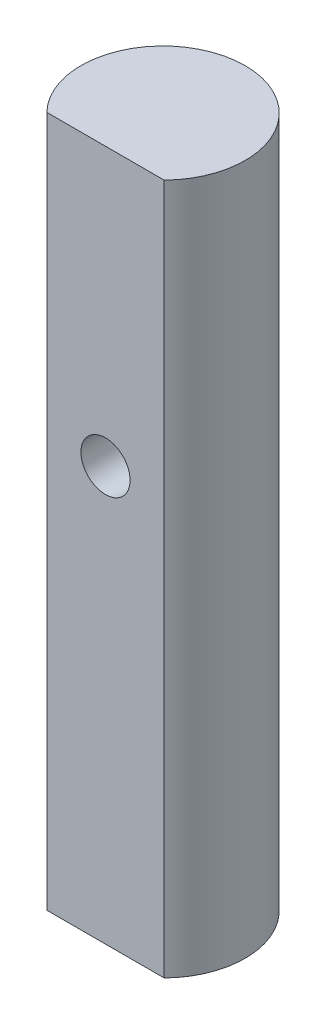
ISO-10303-21;
HEADER;
FILE_DESCRIPTION(('STEP AP214'),'2;1');
FILE_NAME('part.step','',(''),(''),'','','');
FILE_SCHEMA(('AUTOMOTIVE_DESIGN { 1 0 10303 214 1 1 1 1 }'));
ENDSEC;
DATA;
#1=APPLICATION_CONTEXT('core data for automotive mechanical design processes');
#2=APPLICATION_PROTOCOL_DEFINITION('international standard','automotive_design',2000,#1);
#3=PRODUCT_CONTEXT('',#1,'mechanical');
#4=PRODUCT('Part','Part','',(#3));
#5=PRODUCT_RELATED_PRODUCT_CATEGORY('part','',(#4));
#6=PRODUCT_DEFINITION_FORMATION('','',#4);
#7=PRODUCT_DEFINITION_CONTEXT('part definition',#1,'design');
#8=PRODUCT_DEFINITION('design','',#6,#7);
#9=PRODUCT_DEFINITION_SHAPE('','',#8);
#10=(LENGTH_UNIT() NAMED_UNIT(*) SI_UNIT(.MILLI.,.METRE.));
#11=(NAMED_UNIT(*) PLANE_ANGLE_UNIT() SI_UNIT($,.RADIAN.));
#12=(NAMED_UNIT(*) SI_UNIT($,.STERADIAN.) SOLID_ANGLE_UNIT());
#13=UNCERTAINTY_MEASURE_WITH_UNIT(LENGTH_MEASURE(1.E-05),#10,'distance_accuracy_value','');
#14=(GEOMETRIC_REPRESENTATION_CONTEXT(3) GLOBAL_UNCERTAINTY_ASSIGNED_CONTEXT((#13)) GLOBAL_UNIT_ASSIGNED_CONTEXT((#10,
#11,#12)) REPRESENTATION_CONTEXT('',''));
#15=CARTESIAN_POINT('',(0.,0.,0.));
#16=DIRECTION('',(0.,0.,1.));
#17=DIRECTION('',(1.,0.,0.));
#18=AXIS2_PLACEMENT_3D('',#15,#16,#17);
#19=CARTESIAN_POINT('',(0.,53.4019024719999,0.));
#20=DIRECTION('',(0.,-1.,0.));
#21=DIRECTION('',(0.,0.,-1.));
#22=AXIS2_PLACEMENT_3D('',#19,#20,#21);
#23=CYLINDRICAL_SURFACE('',#22,6.35);
#24=CARTESIAN_POINT('',(0.,30.089475,-6.3500000000003));
#25=CARTESIAN_POINT('',(0.104174230071378,30.0894763060569,-6.34999907745002));
#26=CARTESIAN_POINT('',(0.208361677234885,30.0980771084391,-6.34741194322595));
#27=CARTESIAN_POINT('',(0.413703564897657,30.1321720735472,-6.33734405929361));
#28=CARTESIAN_POINT('',(0.514857073747801,30.1576713709863,-6.32986182218663));
#29=CARTESIAN_POINT('',(0.711139592873193,30.2246365760004,-6.31082376723533));
#30=CARTESIAN_POINT('',(0.806277218635521,30.2660790190154,-6.29927393803215));
#31=CARTESIAN_POINT('',(0.988253187796923,30.3636581822995,-6.27330179744045));
#32=CARTESIAN_POINT('',(1.07509044153308,30.4197968282617,-6.25887910967084));
#33=CARTESIAN_POINT('',(1.24047891030717,30.5468630245919,-6.22823999433316));
#34=CARTESIAN_POINT('',(1.31875979836932,30.618133590062,-6.21198699198934));
#35=CARTESIAN_POINT('',(1.46245535318967,30.7727093681745,-6.17973775823127));
#36=CARTESIAN_POINT('',(1.52786787234964,30.8560165855932,-6.16374157008506));
#37=CARTESIAN_POINT('',(1.64538908787593,31.0345841316211,-6.13343056671382));
#38=CARTESIAN_POINT('',(1.69716842823095,31.1300696638274,-6.11916122325647));
#39=CARTESIAN_POINT('',(1.78382461525216,31.3288884312869,-6.09446589742613));
#40=CARTESIAN_POINT('',(1.81870549028692,31.4322197893992,-6.08403899920748));
#41=CARTESIAN_POINT('',(1.86960095013749,31.6407627435154,-6.06859017174986));
#42=CARTESIAN_POINT('',(1.88611365020934,31.7458419444882,-6.06342587458966));
#43=CARTESIAN_POINT('',(1.90135937321492,31.9573963532608,-6.05866338815991));
#44=CARTESIAN_POINT('',(1.90009667171744,32.0638712192016,-6.05906386037997));
#45=CARTESIAN_POINT('',(1.88021881579598,32.2711490599442,-6.06525944714982));
#46=CARTESIAN_POINT('',(1.86222702847388,32.3720185664934,-6.07086075515797));
#47=CARTESIAN_POINT('',(1.81040860261061,32.5692365173697,-6.08651344917327));
#48=CARTESIAN_POINT('',(1.77658041070945,32.6655845171715,-6.09656527171689));
#49=CARTESIAN_POINT('',(1.69358876358904,32.852552371175,-6.12014156612633));
#50=CARTESIAN_POINT('',(1.64422262512324,32.9430762815995,-6.13371149128894));
#51=CARTESIAN_POINT('',(1.53169729719298,33.1147644417618,-6.16277307320922));
#52=CARTESIAN_POINT('',(1.46853478416468,33.195926428989,-6.17826519263676));
#53=CARTESIAN_POINT('',(1.3271108490196,33.3501232962879,-6.210212245628));
#54=CARTESIAN_POINT('',(1.24833191932304,33.4226815957898,-6.22668046499809));
#55=CARTESIAN_POINT('',(1.07951936513868,33.5536676838104,-6.25815467195813));
#56=CARTESIAN_POINT('',(0.989485042148462,33.6120945946833,-6.27316056869434));
#57=CARTESIAN_POINT('',(0.799855333702407,33.7134461892695,-6.30015487523226));
#58=CARTESIAN_POINT('',(0.700200638080903,33.7562657623259,-6.31212266638949));
#59=CARTESIAN_POINT('',(0.494663437454944,33.8243964137821,-6.33154372644205));
#60=CARTESIAN_POINT('',(0.388782666341643,33.849712341926,-6.33899824576079));
#61=CARTESIAN_POINT('',(0.177850894597573,33.8813250751772,-6.34835533637998));
#62=CARTESIAN_POINT('',(0.0729049226430506,33.8882678494776,-6.35044639318698));
#63=CARTESIAN_POINT('',(-0.136659129006901,33.8847469170019,-6.34939358227364));
#64=CARTESIAN_POINT('',(-0.241277250313167,33.8742855169016,-6.34625040827613));
#65=CARTESIAN_POINT('',(-0.444781942193917,33.8367757706514,-6.33520564342841));
#66=CARTESIAN_POINT('',(-0.543744413662501,33.8101043412288,-6.32741225271153));
#67=CARTESIAN_POINT('',(-0.735768622856862,33.7413846270467,-6.30796848523179));
#68=CARTESIAN_POINT('',(-0.828829651453886,33.6993344984459,-6.29631764599294));
#69=CARTESIAN_POINT('',(-1.00879032004296,33.5999631485079,-6.27003255890797));
#70=CARTESIAN_POINT('',(-1.09549867740114,33.5423125006762,-6.25533577597258));
#71=CARTESIAN_POINT('',(-1.25823067273906,33.4137773337544,-6.22464652181085));
#72=CARTESIAN_POINT('',(-1.3342516416571,33.3428895190775,-6.20865372848617));
#73=CARTESIAN_POINT('',(-1.47629145056279,33.1868578015954,-6.17645243900759));
#74=CARTESIAN_POINT('',(-1.54185080419523,33.101292026314,-6.16025695785639));
#75=CARTESIAN_POINT('',(-1.65771183079171,32.9200218443067,-6.13009694049584));
#76=CARTESIAN_POINT('',(-1.70801391463706,32.8243177107024,-6.11613234421311));
#77=CARTESIAN_POINT('',(-1.79158652861863,32.6257994239489,-6.09217616531615));
#78=CARTESIAN_POINT('',(-1.82493730082878,32.5230214339582,-6.0821659152729));
#79=CARTESIAN_POINT('',(-1.87375981206238,32.3129535004674,-6.06730484103354));
#80=CARTESIAN_POINT('',(-1.88923762630833,32.2056651029657,-6.06245226373024));
#81=CARTESIAN_POINT('',(-1.90146374813229,31.9943929826514,-6.05862786351808));
#82=CARTESIAN_POINT('',(-1.89896073312194,31.8904562717344,-6.05942095598844));
#83=CARTESIAN_POINT('',(-1.87708175514671,31.6845576171648,-6.06623379445782));
#84=CARTESIAN_POINT('',(-1.85770645947701,31.5825955955768,-6.07225333375194));
#85=CARTESIAN_POINT('',(-1.80311475679839,31.3847556021407,-6.08868365405113));
#86=CARTESIAN_POINT('',(-1.76809533443216,31.2888183961893,-6.09903973249438));
#87=CARTESIAN_POINT('',(-1.68336272312535,31.1041045470197,-6.12296653822529));
#88=CARTESIAN_POINT('',(-1.6336467363105,31.0153292713618,-6.13653787752392));
#89=CARTESIAN_POINT('',(-1.51882382377394,30.843981878476,-6.16597947053965));
#90=CARTESIAN_POINT('',(-1.45322474564031,30.7617508112098,-6.18191517730378));
#91=CARTESIAN_POINT('',(-1.30938518586601,30.6092211502521,-6.21397068703907));
#92=CARTESIAN_POINT('',(-1.23114143189494,30.538925655064,-6.23009053665855));
#93=CARTESIAN_POINT('',(-1.06150299275839,30.4102336768806,-6.26125794809995));
#94=CARTESIAN_POINT('',(-0.969792965367136,30.3522409539669,-6.27626091077484));
#95=CARTESIAN_POINT('',(-0.777475778034629,30.2525791952375,-6.30297006599699));
#96=CARTESIAN_POINT('',(-0.676872858099818,30.2109024311114,-6.3146778186319));
#97=CARTESIAN_POINT('',(-0.480946828717836,30.1488465361612,-6.3324396356006));
#98=CARTESIAN_POINT('',(-0.386241934326995,30.1266422618804,-6.33897056340221));
#99=CARTESIAN_POINT('',(-0.194361588258421,30.0969570961475,-6.34775082360895));
#100=CARTESIAN_POINT('',(-0.0971865458476309,30.0894737815494,-6.35000086066877));
#101=CARTESIAN_POINT('',(0.,30.089475,-6.3500000000003));
#102=B_SPLINE_CURVE_WITH_KNOTS('',3,(#24,#25,#26,#27,#28,#29,#30,#31,#32,#33,#34,#35,#36,#37,
#38,#39,#40,#41,#42,#43,#44,#45,#46,#47,#48,#49,#50,#51,#52,#53,#54,#55,#56,#57,#58,#59,#60,#61,
#62,#63,#64,#65,#66,#67,#68,#69,#70,#71,#72,#73,#74,#75,#76,#77,#78,#79,#80,#81,#82,#83,#84,#85,
#86,#87,#88,#89,#90,#91,#92,#93,#94,#95,#96,#97,#98,#99,#100,#101),.UNSPECIFIED.,.T.,.F.,(4,2,2,
2,2,2,2,2,2,2,2,2,2,2,2,2,2,2,2,2,2,2,2,2,2,2,2,2,2,2,2,2,2,2,2,2,2,2,4),(0.,0.312165720584867,
0.624426338188593,0.936229129018975,1.24807279689,1.5679313519463,1.88784324289994,
2.21489216211495,2.54186307882265,2.8597328117592,3.17752608787557,3.48393269114425,
3.79036935549848,4.10098164824076,4.41166885056053,4.73523962855106,5.05883049711221,
5.38456205379573,5.7102033236566,6.02423336275797,6.33822178495754,6.64517465691197,
6.95216434329717,7.26622482669834,7.58036360456408,7.90582936913734,8.23128636807428,
8.55518806464503,8.87897963089216,9.18936986001776,9.49974781383187,9.80632319022193,
10.1129569688578,10.4306947974601,10.7485149858714,11.0755434088709,11.4024167417515,
11.6936913033873,11.9849179157164),.UNSPECIFIED.);
#103=CARTESIAN_POINT('',(0.,30.089475,-6.3500000000003));
#104=VERTEX_POINT('',#103);
#105=EDGE_CURVE('E13',#104,#104,#102,.T.);
#106=ORIENTED_EDGE('',*,*,#105,.T.);
#107=EDGE_LOOP('',(#106));
#108=FACE_BOUND('',#107,.T.);
#109=CARTESIAN_POINT('',(0.,53.4019024719999,0.));
#110=DIRECTION('',(0.,1.,0.));
#111=DIRECTION('',(0.,0.,1.));
#112=AXIS2_PLACEMENT_3D('',#109,#110,#111);
#113=CIRCLE('',#112,6.35);
#114=CARTESIAN_POINT('',(4.53480705212471,53.4019024719998,4.44499999999959));
#115=VERTEX_POINT('',#114);
#116=CARTESIAN_POINT('',(-4.53480705212471,53.4019024719998,4.44499999999959));
#117=VERTEX_POINT('',#116);
#118=EDGE_CURVE('E86',#115,#117,#113,.T.);
#119=ORIENTED_EDGE('',*,*,#118,.F.);
#120=DIRECTION('',(0.,-1.,0.));
#121=VECTOR('',#120,1.);
#122=CARTESIAN_POINT('',(4.53480705212471,53.4019024719998,4.44499999999959));
#123=LINE('',#122,#121);
#124=CARTESIAN_POINT('',(4.53480705212471,-1.11022302462516E-13,4.44499999999959));
#125=VERTEX_POINT('',#124);
#126=EDGE_CURVE('E73',#115,#125,#123,.T.);
#127=ORIENTED_EDGE('',*,*,#126,.T.);
#128=CARTESIAN_POINT('',(0.,0.,0.));
#129=DIRECTION('',(0.,1.,0.));
#130=DIRECTION('',(0.,0.,1.));
#131=AXIS2_PLACEMENT_3D('',#128,#129,#130);
#132=CIRCLE('',#131,6.35);
#133=CARTESIAN_POINT('',(-4.53480705212471,-1.11022302462516E-13,4.44499999999959));
#134=VERTEX_POINT('',#133);
#135=EDGE_CURVE('E81',#125,#134,#132,.T.);
#136=ORIENTED_EDGE('',*,*,#135,.T.);
#137=DIRECTION('',(0.,-1.,0.));
#138=VECTOR('',#137,1.);
#139=CARTESIAN_POINT('',(-4.53480705212471,53.4019024719998,4.44499999999959));
#140=LINE('',#139,#138);
#141=EDGE_CURVE('E65',#134,#117,#140,.F.);
#142=ORIENTED_EDGE('',*,*,#141,.T.);
#143=EDGE_LOOP('',(#119,#127,#136,#142));
#144=FACE_BOUND('',#143,.T.);
#145=ADVANCED_FACE('F47',(#108,#144),#23,.T.);
#146=CARTESIAN_POINT('',(0.,53.4019024719999,0.));
#147=DIRECTION('',(0.,1.,0.));
#148=DIRECTION('',(0.,0.,1.));
#149=AXIS2_PLACEMENT_3D('',#146,#147,#148);
#150=PLANE('',#149);
#151=DIRECTION('',(-1.,0.,0.));
#152=VECTOR('',#151,1.);
#153=CARTESIAN_POINT('',(0.,53.4019024719998,4.44499999999959));
#154=LINE('',#153,#152);
#155=EDGE_CURVE('E76',#115,#117,#154,.T.);
#156=ORIENTED_EDGE('',*,*,#155,.F.);
#157=ORIENTED_EDGE('',*,*,#118,.T.);
#158=EDGE_LOOP('',(#156,#157));
#159=FACE_BOUND('',#158,.T.);
#160=ADVANCED_FACE('F85',(#159),#150,.T.);
#161=CARTESIAN_POINT('',(0.,0.,0.));
#162=DIRECTION('',(0.,1.,0.));
#163=DIRECTION('',(0.,0.,1.));
#164=AXIS2_PLACEMENT_3D('',#161,#162,#163);
#165=PLANE('',#164);
#166=ORIENTED_EDGE('',*,*,#135,.F.);
#167=DIRECTION('',(-1.,0.,0.));
#168=VECTOR('',#167,1.);
#169=CARTESIAN_POINT('',(0.,-1.11022302462516E-13,4.44499999999959));
#170=LINE('',#169,#168);
#171=EDGE_CURVE('E58',#125,#134,#170,.T.);
#172=ORIENTED_EDGE('',*,*,#171,.T.);
#173=EDGE_LOOP('',(#166,#172));
#174=FACE_BOUND('',#173,.T.);
#175=ADVANCED_FACE('F100',(#174),#165,.F.);
#176=CARTESIAN_POINT('',(0.,-1.11022302462516E-13,4.44499999999959));
#177=DIRECTION('',(0.,0.,-1.));
#178=DIRECTION('',(-1.,0.,0.));
#179=AXIS2_PLACEMENT_3D('',#176,#177,#178);
#180=PLANE('',#179);
#181=CARTESIAN_POINT('',(0.,31.9881249999999,4.44499999999959));
#182=DIRECTION('',(0.,0.,1.));
#183=DIRECTION('',(1.,0.,0.));
#184=AXIS2_PLACEMENT_3D('',#181,#182,#183);
#185=CIRCLE('',#184,1.89865);
#186=CARTESIAN_POINT('',(1.89865,31.9881249999999,4.44499999999959));
#187=VERTEX_POINT('',#186);
#188=EDGE_CURVE('E87',#187,#187,#185,.T.);
#189=ORIENTED_EDGE('',*,*,#188,.F.);
#190=EDGE_LOOP('',(#189));
#191=FACE_BOUND('',#190,.T.);
#192=ORIENTED_EDGE('',*,*,#155,.T.);
#193=ORIENTED_EDGE('',*,*,#141,.F.);
#194=ORIENTED_EDGE('',*,*,#171,.F.);
#195=ORIENTED_EDGE('',*,*,#126,.F.);
#196=EDGE_LOOP('',(#192,#193,#194,#195));
#197=FACE_BOUND('',#196,.T.);
#198=ADVANCED_FACE('F75',(#191,#197),#180,.F.);
#199=CARTESIAN_POINT('',(0.,31.9881249999999,4.44499999999959));
#200=DIRECTION('',(0.,0.,1.));
#201=DIRECTION('',(1.,0.,0.));
#202=AXIS2_PLACEMENT_3D('',#199,#200,#201);
#203=CYLINDRICAL_SURFACE('',#202,1.89865);
#204=ORIENTED_EDGE('',*,*,#188,.T.);
#205=EDGE_LOOP('',(#204));
#206=FACE_BOUND('',#205,.T.);
#207=ORIENTED_EDGE('',*,*,#105,.F.);
#208=EDGE_LOOP('',(#207));
#209=FACE_BOUND('',#208,.T.);
#210=ADVANCED_FACE('F96',(#206,#209),#203,.F.);
#211=CLOSED_SHELL('',(#145,#160,#175,#198,#210));
#212=MANIFOLD_SOLID_BREP('B2',#211);
#213=ADVANCED_BREP_SHAPE_REPRESENTATION('',(#18,#212),#14);
#214=SHAPE_DEFINITION_REPRESENTATION(#9,#213);
ENDSEC;
END-ISO-10303-21;
